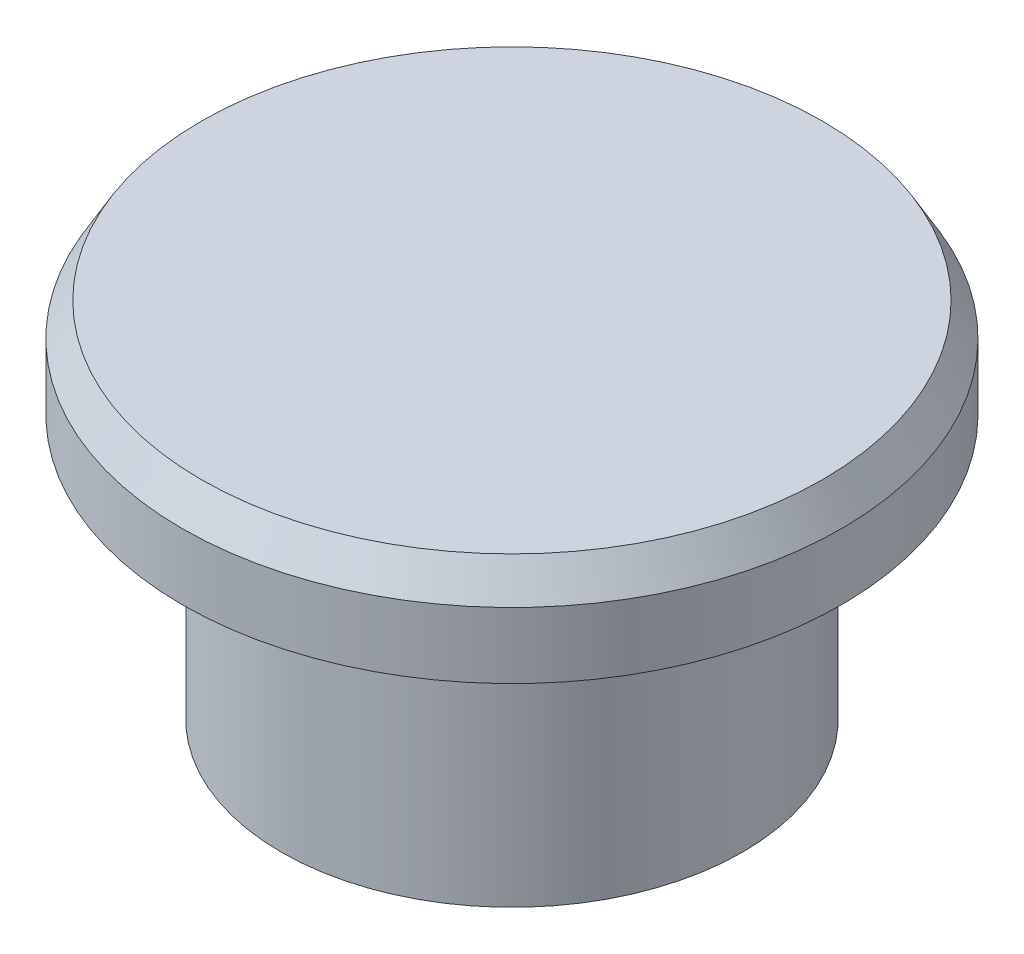
ISO-10303-21;
HEADER;
FILE_DESCRIPTION(('STEP AP214'),'2;1');
FILE_NAME('part.step','',(''),(''),'','','');
FILE_SCHEMA(('AUTOMOTIVE_DESIGN { 1 0 10303 214 1 1 1 1 }'));
ENDSEC;
DATA;
#1=APPLICATION_CONTEXT('core data for automotive mechanical design processes');
#2=APPLICATION_PROTOCOL_DEFINITION('international standard','automotive_design',2000,#1);
#3=PRODUCT_CONTEXT('',#1,'mechanical');
#4=PRODUCT('Part','Part','',(#3));
#5=PRODUCT_RELATED_PRODUCT_CATEGORY('part','',(#4));
#6=PRODUCT_DEFINITION_FORMATION('','',#4);
#7=PRODUCT_DEFINITION_CONTEXT('part definition',#1,'design');
#8=PRODUCT_DEFINITION('design','',#6,#7);
#9=PRODUCT_DEFINITION_SHAPE('','',#8);
#10=(LENGTH_UNIT() NAMED_UNIT(*) SI_UNIT(.MILLI.,.METRE.));
#11=(NAMED_UNIT(*) PLANE_ANGLE_UNIT() SI_UNIT($,.RADIAN.));
#12=(NAMED_UNIT(*) SI_UNIT($,.STERADIAN.) SOLID_ANGLE_UNIT());
#13=UNCERTAINTY_MEASURE_WITH_UNIT(LENGTH_MEASURE(1.E-05),#10,'distance_accuracy_value','');
#14=(GEOMETRIC_REPRESENTATION_CONTEXT(3) GLOBAL_UNCERTAINTY_ASSIGNED_CONTEXT((#13)) GLOBAL_UNIT_ASSIGNED_CONTEXT((#10,
#11,#12)) REPRESENTATION_CONTEXT('',''));
#15=CARTESIAN_POINT('',(0.,0.,0.));
#16=DIRECTION('',(0.,0.,1.));
#17=DIRECTION('',(1.,0.,0.));
#18=AXIS2_PLACEMENT_3D('',#15,#16,#17);
#19=CARTESIAN_POINT('',(0.,14.,0.));
#20=DIRECTION('',(0.,-1.,0.));
#21=DIRECTION('',(0.,0.,-1.));
#22=AXIS2_PLACEMENT_3D('',#19,#20,#21);
#23=CYLINDRICAL_SURFACE('',#22,14.);
#24=CARTESIAN_POINT('',(0.,14.,0.));
#25=DIRECTION('',(0.,1.,0.));
#26=DIRECTION('',(0.,0.,1.));
#27=AXIS2_PLACEMENT_3D('',#24,#25,#26);
#28=CIRCLE('',#27,14.);
#29=CARTESIAN_POINT('',(0.,14.,14.));
#30=VERTEX_POINT('',#29);
#31=EDGE_CURVE('E52',#30,#30,#28,.T.);
#32=ORIENTED_EDGE('',*,*,#31,.F.);
#33=EDGE_LOOP('',(#32));
#34=FACE_BOUND('',#33,.T.);
#35=CARTESIAN_POINT('',(0.,0.,0.));
#36=DIRECTION('',(0.,1.,0.));
#37=DIRECTION('',(0.,0.,1.));
#38=AXIS2_PLACEMENT_3D('',#35,#36,#37);
#39=CIRCLE('',#38,14.);
#40=CARTESIAN_POINT('',(0.,0.,14.));
#41=VERTEX_POINT('',#40);
#42=EDGE_CURVE('E55',#41,#41,#39,.T.);
#43=ORIENTED_EDGE('',*,*,#42,.T.);
#44=EDGE_LOOP('',(#43));
#45=FACE_BOUND('',#44,.T.);
#46=ADVANCED_FACE('F37',(#34,#45),#23,.T.);
#47=CARTESIAN_POINT('',(0.,14.,0.));
#48=DIRECTION('',(0.,1.,0.));
#49=DIRECTION('',(0.,0.,1.));
#50=AXIS2_PLACEMENT_3D('',#47,#48,#49);
#51=PLANE('',#50);
#52=CARTESIAN_POINT('',(0.,14.,0.));
#53=DIRECTION('',(0.,1.,0.));
#54=DIRECTION('',(0.,0.,1.));
#55=AXIS2_PLACEMENT_3D('',#52,#53,#54);
#56=CIRCLE('',#55,10.5);
#57=CARTESIAN_POINT('',(0.,14.,10.5));
#58=VERTEX_POINT('',#57);
#59=EDGE_CURVE('E48',#58,#58,#56,.T.);
#60=ORIENTED_EDGE('',*,*,#59,.F.);
#61=EDGE_LOOP('',(#60));
#62=FACE_BOUND('',#61,.T.);
#63=ORIENTED_EDGE('',*,*,#31,.T.);
#64=EDGE_LOOP('',(#63));
#65=FACE_BOUND('',#64,.T.);
#66=ADVANCED_FACE('F82',(#62,#65),#51,.T.);
#67=CARTESIAN_POINT('',(0.,0.,0.));
#68=DIRECTION('',(0.,1.,0.));
#69=DIRECTION('',(0.,0.,1.));
#70=AXIS2_PLACEMENT_3D('',#67,#68,#69);
#71=PLANE('',#70);
#72=ORIENTED_EDGE('',*,*,#42,.F.);
#73=EDGE_LOOP('',(#72));
#74=FACE_BOUND('',#73,.T.);
#75=ADVANCED_FACE('F87',(#74),#71,.F.);
#76=CARTESIAN_POINT('',(0.,16.,0.));
#77=DIRECTION('',(0.,-1.,0.));
#78=DIRECTION('',(0.,0.,-1.));
#79=AXIS2_PLACEMENT_3D('',#76,#77,#78);
#80=CYLINDRICAL_SURFACE('',#79,10.5);
#81=CARTESIAN_POINT('',(0.,16.,0.));
#82=DIRECTION('',(0.,1.,0.));
#83=DIRECTION('',(0.,0.,1.));
#84=AXIS2_PLACEMENT_3D('',#81,#82,#83);
#85=CIRCLE('',#84,10.5);
#86=CARTESIAN_POINT('',(0.,16.,10.5));
#87=VERTEX_POINT('',#86);
#88=EDGE_CURVE('E58',#87,#87,#85,.T.);
#89=ORIENTED_EDGE('',*,*,#88,.F.);
#90=EDGE_LOOP('',(#89));
#91=FACE_BOUND('',#90,.T.);
#92=ORIENTED_EDGE('',*,*,#59,.T.);
#93=EDGE_LOOP('',(#92));
#94=FACE_BOUND('',#93,.T.);
#95=ADVANCED_FACE('F79',(#91,#94),#80,.T.);
#96=CARTESIAN_POINT('',(0.,20.,0.));
#97=DIRECTION('',(0.,-1.,0.));
#98=DIRECTION('',(0.,0.,-1.));
#99=AXIS2_PLACEMENT_3D('',#96,#97,#98);
#100=CYLINDRICAL_SURFACE('',#99,20.);
#101=CARTESIAN_POINT('',(0.,20.,0.));
#102=DIRECTION('',(0.,1.,0.));
#103=DIRECTION('',(0.,0.,1.));
#104=AXIS2_PLACEMENT_3D('',#101,#102,#103);
#105=CIRCLE('',#104,20.);
#106=CARTESIAN_POINT('',(0.,20.,20.));
#107=VERTEX_POINT('',#106);
#108=EDGE_CURVE('E10',#107,#107,#105,.F.);
#109=ORIENTED_EDGE('',*,*,#108,.T.);
#110=EDGE_LOOP('',(#109));
#111=FACE_BOUND('',#110,.T.);
#112=CARTESIAN_POINT('',(0.,16.,0.));
#113=DIRECTION('',(0.,1.,0.));
#114=DIRECTION('',(0.,0.,1.));
#115=AXIS2_PLACEMENT_3D('',#112,#113,#114);
#116=CIRCLE('',#115,20.);
#117=CARTESIAN_POINT('',(0.,16.,20.));
#118=VERTEX_POINT('',#117);
#119=EDGE_CURVE('E63',#118,#118,#116,.T.);
#120=ORIENTED_EDGE('',*,*,#119,.T.);
#121=EDGE_LOOP('',(#120));
#122=FACE_BOUND('',#121,.T.);
#123=ADVANCED_FACE('F67',(#111,#122),#100,.T.);
#124=CARTESIAN_POINT('',(0.,16.,0.));
#125=DIRECTION('',(0.,1.,0.));
#126=DIRECTION('',(0.,0.,1.));
#127=AXIS2_PLACEMENT_3D('',#124,#125,#126);
#128=PLANE('',#127);
#129=ORIENTED_EDGE('',*,*,#88,.T.);
#130=EDGE_LOOP('',(#129));
#131=FACE_BOUND('',#130,.T.);
#132=ORIENTED_EDGE('',*,*,#119,.F.);
#133=EDGE_LOOP('',(#132));
#134=FACE_BOUND('',#133,.T.);
#135=ADVANCED_FACE('F69',(#131,#134),#128,.F.);
#136=CARTESIAN_POINT('',(0.,22.,0.));
#137=DIRECTION('',(0.,1.,0.));
#138=DIRECTION('',(0.,0.,1.));
#139=AXIS2_PLACEMENT_3D('',#136,#137,#138);
#140=PLANE('',#139);
#141=CARTESIAN_POINT('',(0.,22.,0.));
#142=DIRECTION('',(0.,1.,0.));
#143=DIRECTION('',(0.,0.,1.));
#144=AXIS2_PLACEMENT_3D('',#141,#142,#143);
#145=CIRCLE('',#144,18.8452994616208);
#146=CARTESIAN_POINT('',(0.,22.,18.8452994616208));
#147=VERTEX_POINT('',#146);
#148=EDGE_CURVE('E44',#147,#147,#145,.T.);
#149=ORIENTED_EDGE('',*,*,#148,.T.);
#150=EDGE_LOOP('',(#149));
#151=FACE_BOUND('',#150,.T.);
#152=ADVANCED_FACE('F71',(#151),#140,.T.);
#153=CARTESIAN_POINT('',(0.,22.,0.));
#154=DIRECTION('',(0.,-1.,0.));
#155=DIRECTION('',(0.,0.,-1.));
#156=AXIS2_PLACEMENT_3D('',#153,#154,#155);
#157=CONICAL_SURFACE('',#156,18.8452994616208,0.523598775598296);
#158=ORIENTED_EDGE('',*,*,#108,.F.);
#159=EDGE_LOOP('',(#158));
#160=FACE_BOUND('',#159,.T.);
#161=ORIENTED_EDGE('',*,*,#148,.F.);
#162=EDGE_LOOP('',(#161));
#163=FACE_BOUND('',#162,.T.);
#164=ADVANCED_FACE('F39',(#160,#163),#157,.T.);
#165=CLOSED_SHELL('',(#46,#66,#75,#95,#123,#135,#152,#164));
#166=MANIFOLD_SOLID_BREP('B2',#165);
#167=ADVANCED_BREP_SHAPE_REPRESENTATION('',(#18,#166),#14);
#168=SHAPE_DEFINITION_REPRESENTATION(#9,#167);
ENDSEC;
END-ISO-10303-21;
